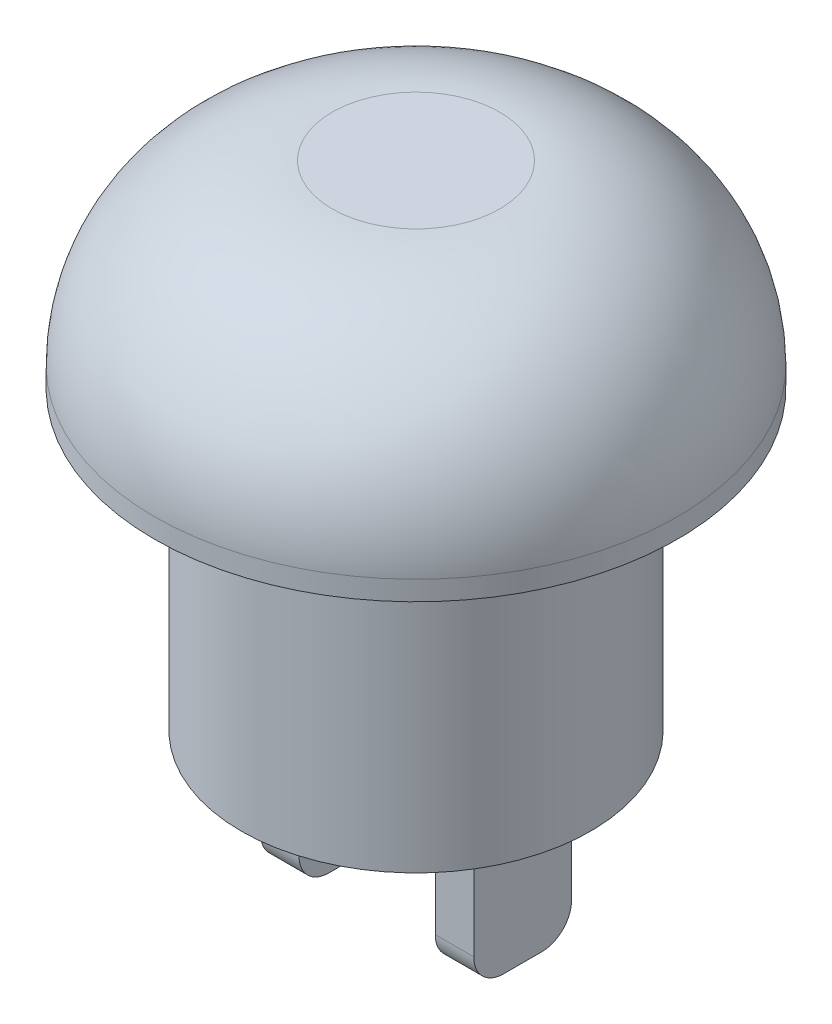
ISO-10303-21;
HEADER;
FILE_DESCRIPTION(('STEP AP214'),'2;1');
FILE_NAME('part.step','',(''),(''),'','','');
FILE_SCHEMA(('AUTOMOTIVE_DESIGN { 1 0 10303 214 1 1 1 1 }'));
ENDSEC;
DATA;
#1=APPLICATION_CONTEXT('core data for automotive mechanical design processes');
#2=APPLICATION_PROTOCOL_DEFINITION('international standard','automotive_design',2000,#1);
#3=PRODUCT_CONTEXT('',#1,'mechanical');
#4=PRODUCT('Part','Part','',(#3));
#5=PRODUCT_RELATED_PRODUCT_CATEGORY('part','',(#4));
#6=PRODUCT_DEFINITION_FORMATION('','',#4);
#7=PRODUCT_DEFINITION_CONTEXT('part definition',#1,'design');
#8=PRODUCT_DEFINITION('design','',#6,#7);
#9=PRODUCT_DEFINITION_SHAPE('','',#8);
#10=(LENGTH_UNIT() NAMED_UNIT(*) SI_UNIT(.MILLI.,.METRE.));
#11=(NAMED_UNIT(*) PLANE_ANGLE_UNIT() SI_UNIT($,.RADIAN.));
#12=(NAMED_UNIT(*) SI_UNIT($,.STERADIAN.) SOLID_ANGLE_UNIT());
#13=UNCERTAINTY_MEASURE_WITH_UNIT(LENGTH_MEASURE(1.E-05),#10,'distance_accuracy_value','');
#14=(GEOMETRIC_REPRESENTATION_CONTEXT(3) GLOBAL_UNCERTAINTY_ASSIGNED_CONTEXT((#13)) GLOBAL_UNIT_ASSIGNED_CONTEXT((#10,
#11,#12)) REPRESENTATION_CONTEXT('',''));
#15=CARTESIAN_POINT('',(0.,0.,0.));
#16=DIRECTION('',(0.,0.,1.));
#17=DIRECTION('',(1.,0.,0.));
#18=AXIS2_PLACEMENT_3D('',#15,#16,#17);
#19=CARTESIAN_POINT('',(0.,10.,0.));
#20=DIRECTION('',(0.,-1.,0.));
#21=DIRECTION('',(0.,0.,-1.));
#22=AXIS2_PLACEMENT_3D('',#19,#20,#21);
#23=CYLINDRICAL_SURFACE('',#22,5.9);
#24=CARTESIAN_POINT('',(0.,10.,0.));
#25=DIRECTION('',(0.,1.,0.));
#26=DIRECTION('',(0.,0.,1.));
#27=AXIS2_PLACEMENT_3D('',#24,#25,#26);
#28=CIRCLE('',#27,5.9);
#29=CARTESIAN_POINT('',(0.,10.,5.9));
#30=VERTEX_POINT('',#29);
#31=EDGE_CURVE('E196',#30,#30,#28,.T.);
#32=ORIENTED_EDGE('',*,*,#31,.F.);
#33=EDGE_LOOP('',(#32));
#34=FACE_BOUND('',#33,.T.);
#35=CARTESIAN_POINT('',(0.,0.,0.));
#36=DIRECTION('',(0.,1.,0.));
#37=DIRECTION('',(0.,0.,1.));
#38=AXIS2_PLACEMENT_3D('',#35,#36,#37);
#39=CIRCLE('',#38,5.9);
#40=CARTESIAN_POINT('',(0.,0.,5.9));
#41=VERTEX_POINT('',#40);
#42=EDGE_CURVE('E195',#41,#41,#39,.T.);
#43=ORIENTED_EDGE('',*,*,#42,.T.);
#44=EDGE_LOOP('',(#43));
#45=FACE_BOUND('',#44,.T.);
#46=ADVANCED_FACE('F43',(#34,#45),#23,.T.);
#47=CARTESIAN_POINT('',(0.,0.,0.));
#48=DIRECTION('',(0.,1.,0.));
#49=DIRECTION('',(0.,0.,1.));
#50=AXIS2_PLACEMENT_3D('',#47,#48,#49);
#51=PLANE('',#50);
#52=DIRECTION('',(1.,0.,0.));
#53=VECTOR('',#52,1.);
#54=CARTESIAN_POINT('',(0.,0.,-1.65));
#55=LINE('',#54,#53);
#56=CARTESIAN_POINT('',(-3.6,0.,-1.65));
#57=VERTEX_POINT('',#56);
#58=CARTESIAN_POINT('',(-2.3,0.,-1.65));
#59=VERTEX_POINT('',#58);
#60=EDGE_CURVE('E135',#57,#59,#55,.T.);
#61=ORIENTED_EDGE('',*,*,#60,.F.);
#62=DIRECTION('',(0.,0.,1.));
#63=VECTOR('',#62,1.);
#64=CARTESIAN_POINT('',(-3.6,0.,0.));
#65=LINE('',#64,#63);
#66=CARTESIAN_POINT('',(-3.6,0.,1.65));
#67=VERTEX_POINT('',#66);
#68=EDGE_CURVE('E143',#57,#67,#65,.T.);
#69=ORIENTED_EDGE('',*,*,#68,.T.);
#70=DIRECTION('',(1.,0.,0.));
#71=VECTOR('',#70,1.);
#72=CARTESIAN_POINT('',(0.,0.,1.65));
#73=LINE('',#72,#71);
#74=CARTESIAN_POINT('',(-2.3,0.,1.65));
#75=VERTEX_POINT('',#74);
#76=EDGE_CURVE('E156',#67,#75,#73,.T.);
#77=ORIENTED_EDGE('',*,*,#76,.T.);
#78=DIRECTION('',(0.,0.,1.));
#79=VECTOR('',#78,1.);
#80=CARTESIAN_POINT('',(-2.3,0.,0.));
#81=LINE('',#80,#79);
#82=EDGE_CURVE('E154',#59,#75,#81,.T.);
#83=ORIENTED_EDGE('',*,*,#82,.F.);
#84=EDGE_LOOP('',(#61,#69,#77,#83));
#85=FACE_BOUND('',#84,.T.);
#86=DIRECTION('',(0.,0.,1.));
#87=VECTOR('',#86,1.);
#88=CARTESIAN_POINT('',(3.6,0.,0.));
#89=LINE('',#88,#87);
#90=CARTESIAN_POINT('',(3.6,0.,-1.65));
#91=VERTEX_POINT('',#90);
#92=CARTESIAN_POINT('',(3.6,0.,1.65));
#93=VERTEX_POINT('',#92);
#94=EDGE_CURVE('E177',#91,#93,#89,.T.);
#95=ORIENTED_EDGE('',*,*,#94,.F.);
#96=DIRECTION('',(-1.,0.,0.));
#97=VECTOR('',#96,1.);
#98=CARTESIAN_POINT('',(0.,0.,-1.65));
#99=LINE('',#98,#97);
#100=CARTESIAN_POINT('',(2.3,0.,-1.65));
#101=VERTEX_POINT('',#100);
#102=EDGE_CURVE('E139',#91,#101,#99,.T.);
#103=ORIENTED_EDGE('',*,*,#102,.T.);
#104=DIRECTION('',(0.,0.,1.));
#105=VECTOR('',#104,1.);
#106=CARTESIAN_POINT('',(2.3,0.,0.));
#107=LINE('',#106,#105);
#108=CARTESIAN_POINT('',(2.3,0.,1.65));
#109=VERTEX_POINT('',#108);
#110=EDGE_CURVE('E171',#101,#109,#107,.T.);
#111=ORIENTED_EDGE('',*,*,#110,.T.);
#112=DIRECTION('',(-1.,0.,0.));
#113=VECTOR('',#112,1.);
#114=CARTESIAN_POINT('',(0.,0.,1.65));
#115=LINE('',#114,#113);
#116=EDGE_CURVE('E180',#93,#109,#115,.T.);
#117=ORIENTED_EDGE('',*,*,#116,.F.);
#118=EDGE_LOOP('',(#95,#103,#111,#117));
#119=FACE_BOUND('',#118,.T.);
#120=ORIENTED_EDGE('',*,*,#42,.F.);
#121=EDGE_LOOP('',(#120));
#122=FACE_BOUND('',#121,.T.);
#123=ADVANCED_FACE('F151',(#85,#119,#122),#51,.F.);
#124=CARTESIAN_POINT('',(0.,16.66,0.));
#125=DIRECTION('',(0.,-1.,0.));
#126=DIRECTION('',(0.,0.,-1.));
#127=AXIS2_PLACEMENT_3D('',#124,#125,#126);
#128=CYLINDRICAL_SURFACE('',#127,8.83);
#129=CARTESIAN_POINT('',(0.,10.66,0.));
#130=DIRECTION('',(0.,1.,0.));
#131=DIRECTION('',(0.,0.,1.));
#132=AXIS2_PLACEMENT_3D('',#129,#130,#131);
#133=CIRCLE('',#132,8.83);
#134=CARTESIAN_POINT('',(0.,10.66,8.83));
#135=VERTEX_POINT('',#134);
#136=EDGE_CURVE('E204',#135,#135,#133,.F.);
#137=ORIENTED_EDGE('',*,*,#136,.T.);
#138=EDGE_LOOP('',(#137));
#139=FACE_BOUND('',#138,.T.);
#140=CARTESIAN_POINT('',(0.,10.,0.));
#141=DIRECTION('',(0.,1.,0.));
#142=DIRECTION('',(0.,0.,1.));
#143=AXIS2_PLACEMENT_3D('',#140,#141,#142);
#144=CIRCLE('',#143,8.83);
#145=CARTESIAN_POINT('',(0.,10.,8.83));
#146=VERTEX_POINT('',#145);
#147=EDGE_CURVE('E192',#146,#146,#144,.T.);
#148=ORIENTED_EDGE('',*,*,#147,.T.);
#149=EDGE_LOOP('',(#148));
#150=FACE_BOUND('',#149,.T.);
#151=ADVANCED_FACE('F262',(#139,#150),#128,.T.);
#152=CARTESIAN_POINT('',(0.,16.66,0.));
#153=DIRECTION('',(0.,1.,0.));
#154=DIRECTION('',(0.,0.,1.));
#155=AXIS2_PLACEMENT_3D('',#152,#153,#154);
#156=PLANE('',#155);
#157=CARTESIAN_POINT('',(0.,16.66,0.));
#158=DIRECTION('',(0.,1.,0.));
#159=DIRECTION('',(0.,0.,1.));
#160=AXIS2_PLACEMENT_3D('',#157,#158,#159);
#161=CIRCLE('',#160,2.83);
#162=CARTESIAN_POINT('',(0.,16.66,2.83));
#163=VERTEX_POINT('',#162);
#164=EDGE_CURVE('E199',#163,#163,#161,.T.);
#165=ORIENTED_EDGE('',*,*,#164,.T.);
#166=EDGE_LOOP('',(#165));
#167=FACE_BOUND('',#166,.T.);
#168=ADVANCED_FACE('F320',(#167),#156,.T.);
#169=CARTESIAN_POINT('',(0.,10.,0.));
#170=DIRECTION('',(0.,1.,0.));
#171=DIRECTION('',(0.,0.,1.));
#172=AXIS2_PLACEMENT_3D('',#169,#170,#171);
#173=PLANE('',#172);
#174=ORIENTED_EDGE('',*,*,#31,.T.);
#175=EDGE_LOOP('',(#174));
#176=FACE_BOUND('',#175,.T.);
#177=ORIENTED_EDGE('',*,*,#147,.F.);
#178=EDGE_LOOP('',(#177));
#179=FACE_BOUND('',#178,.T.);
#180=ADVANCED_FACE('F272',(#176,#179),#173,.F.);
#181=CARTESIAN_POINT('',(0.,10.66,0.));
#182=DIRECTION('',(0.,1.,0.));
#183=DIRECTION('',(0.,0.,1.));
#184=AXIS2_PLACEMENT_3D('',#181,#182,#183);
#185=DEGENERATE_TOROIDAL_SURFACE('',#184,2.83,6.,.T.);
#186=ORIENTED_EDGE('',*,*,#136,.F.);
#187=EDGE_LOOP('',(#186));
#188=FACE_BOUND('',#187,.T.);
#189=ORIENTED_EDGE('',*,*,#164,.F.);
#190=EDGE_LOOP('',(#189));
#191=FACE_BOUND('',#190,.T.);
#192=ADVANCED_FACE('F268',(#188,#191),#185,.T.);
#193=CARTESIAN_POINT('',(0.,-5.,-1.65));
#194=DIRECTION('',(0.,0.,-1.));
#195=DIRECTION('',(-1.,0.,0.));
#196=AXIS2_PLACEMENT_3D('',#193,#194,#195);
#197=PLANE('',#196);
#198=DIRECTION('',(0.,1.,0.));
#199=VECTOR('',#198,1.);
#200=CARTESIAN_POINT('',(3.6,-5.,-1.65));
#201=LINE('',#200,#199);
#202=CARTESIAN_POINT('',(3.6,-4.,-1.65));
#203=VERTEX_POINT('',#202);
#204=EDGE_CURVE('E190',#203,#91,#201,.T.);
#205=ORIENTED_EDGE('',*,*,#204,.F.);
#206=DIRECTION('',(-1.,0.,0.));
#207=VECTOR('',#206,1.);
#208=CARTESIAN_POINT('',(0.,-4.,-1.65));
#209=LINE('',#208,#207);
#210=CARTESIAN_POINT('',(2.3,-4.,-1.65));
#211=VERTEX_POINT('',#210);
#212=EDGE_CURVE('E222',#203,#211,#209,.T.);
#213=ORIENTED_EDGE('',*,*,#212,.T.);
#214=DIRECTION('',(0.,1.,0.));
#215=VECTOR('',#214,1.);
#216=CARTESIAN_POINT('',(2.3,-5.,-1.65));
#217=LINE('',#216,#215);
#218=EDGE_CURVE('E174',#211,#101,#217,.T.);
#219=ORIENTED_EDGE('',*,*,#218,.T.);
#220=ORIENTED_EDGE('',*,*,#102,.F.);
#221=EDGE_LOOP('',(#205,#213,#219,#220));
#222=FACE_BOUND('',#221,.T.);
#223=ADVANCED_FACE('F271',(#222),#197,.T.);
#224=CARTESIAN_POINT('',(3.6,-5.,0.));
#225=DIRECTION('',(-1.,0.,0.));
#226=DIRECTION('',(0.,0.,1.));
#227=AXIS2_PLACEMENT_3D('',#224,#225,#226);
#228=PLANE('',#227);
#229=DIRECTION('',(0.,1.,0.));
#230=VECTOR('',#229,1.);
#231=CARTESIAN_POINT('',(3.6,-5.,1.65));
#232=LINE('',#231,#230);
#233=CARTESIAN_POINT('',(3.6,-4.,1.65));
#234=VERTEX_POINT('',#233);
#235=EDGE_CURVE('E188',#234,#93,#232,.T.);
#236=ORIENTED_EDGE('',*,*,#235,.F.);
#237=CARTESIAN_POINT('',(3.6,-4.,0.649999999999996));
#238=DIRECTION('',(-1.,0.,0.));
#239=DIRECTION('',(0.,0.,1.));
#240=AXIS2_PLACEMENT_3D('',#237,#238,#239);
#241=CIRCLE('',#240,1.);
#242=CARTESIAN_POINT('',(3.6,-5.,0.649999999999996));
#243=VERTEX_POINT('',#242);
#244=EDGE_CURVE('E220',#234,#243,#241,.F.);
#245=ORIENTED_EDGE('',*,*,#244,.T.);
#246=DIRECTION('',(0.,0.,1.));
#247=VECTOR('',#246,1.);
#248=CARTESIAN_POINT('',(3.6,-5.,0.));
#249=LINE('',#248,#247);
#250=CARTESIAN_POINT('',(3.6,-5.,-0.650000000000002));
#251=VERTEX_POINT('',#250);
#252=EDGE_CURVE('E167',#251,#243,#249,.T.);
#253=ORIENTED_EDGE('',*,*,#252,.F.);
#254=CARTESIAN_POINT('',(3.6,-4.,-0.650000000000002));
#255=DIRECTION('',(-1.,0.,0.));
#256=DIRECTION('',(0.,0.,1.));
#257=AXIS2_PLACEMENT_3D('',#254,#255,#256);
#258=CIRCLE('',#257,1.);
#259=EDGE_CURVE('E218',#251,#203,#258,.F.);
#260=ORIENTED_EDGE('',*,*,#259,.T.);
#261=ORIENTED_EDGE('',*,*,#204,.T.);
#262=ORIENTED_EDGE('',*,*,#94,.T.);
#263=EDGE_LOOP('',(#236,#245,#253,#260,#261,#262));
#264=FACE_BOUND('',#263,.T.);
#265=ADVANCED_FACE('F289',(#264),#228,.F.);
#266=CARTESIAN_POINT('',(0.,-5.,1.65));
#267=DIRECTION('',(0.,0.,-1.));
#268=DIRECTION('',(-1.,0.,0.));
#269=AXIS2_PLACEMENT_3D('',#266,#267,#268);
#270=PLANE('',#269);
#271=DIRECTION('',(0.,1.,0.));
#272=VECTOR('',#271,1.);
#273=CARTESIAN_POINT('',(2.3,-5.,1.65));
#274=LINE('',#273,#272);
#275=CARTESIAN_POINT('',(2.3,-4.,1.65));
#276=VERTEX_POINT('',#275);
#277=EDGE_CURVE('E186',#276,#109,#274,.T.);
#278=ORIENTED_EDGE('',*,*,#277,.F.);
#279=DIRECTION('',(-1.,0.,0.));
#280=VECTOR('',#279,1.);
#281=CARTESIAN_POINT('',(3.6,-4.,1.65));
#282=LINE('',#281,#280);
#283=EDGE_CURVE('E216',#276,#234,#282,.F.);
#284=ORIENTED_EDGE('',*,*,#283,.T.);
#285=ORIENTED_EDGE('',*,*,#235,.T.);
#286=ORIENTED_EDGE('',*,*,#116,.T.);
#287=EDGE_LOOP('',(#278,#284,#285,#286));
#288=FACE_BOUND('',#287,.T.);
#289=ADVANCED_FACE('F307',(#288),#270,.F.);
#290=CARTESIAN_POINT('',(2.3,-5.,0.));
#291=DIRECTION('',(-1.,0.,0.));
#292=DIRECTION('',(0.,0.,1.));
#293=AXIS2_PLACEMENT_3D('',#290,#291,#292);
#294=PLANE('',#293);
#295=DIRECTION('',(0.,0.,1.));
#296=VECTOR('',#295,1.);
#297=CARTESIAN_POINT('',(2.3,-5.,0.));
#298=LINE('',#297,#296);
#299=CARTESIAN_POINT('',(2.3,-5.,-0.650000000000002));
#300=VERTEX_POINT('',#299);
#301=CARTESIAN_POINT('',(2.3,-5.,0.649999999999996));
#302=VERTEX_POINT('',#301);
#303=EDGE_CURVE('E170',#300,#302,#298,.T.);
#304=ORIENTED_EDGE('',*,*,#303,.T.);
#305=CARTESIAN_POINT('',(2.3,-4.,0.649999999999996));
#306=DIRECTION('',(-1.,0.,0.));
#307=DIRECTION('',(0.,0.,1.));
#308=AXIS2_PLACEMENT_3D('',#305,#306,#307);
#309=CIRCLE('',#308,1.);
#310=EDGE_CURVE('E214',#302,#276,#309,.T.);
#311=ORIENTED_EDGE('',*,*,#310,.T.);
#312=ORIENTED_EDGE('',*,*,#277,.T.);
#313=ORIENTED_EDGE('',*,*,#110,.F.);
#314=ORIENTED_EDGE('',*,*,#218,.F.);
#315=CARTESIAN_POINT('',(2.3,-4.,-0.650000000000002));
#316=DIRECTION('',(-1.,0.,0.));
#317=DIRECTION('',(0.,0.,1.));
#318=AXIS2_PLACEMENT_3D('',#315,#316,#317);
#319=CIRCLE('',#318,1.);
#320=EDGE_CURVE('E212',#211,#300,#319,.T.);
#321=ORIENTED_EDGE('',*,*,#320,.T.);
#322=EDGE_LOOP('',(#304,#311,#312,#313,#314,#321));
#323=FACE_BOUND('',#322,.T.);
#324=ADVANCED_FACE('F305',(#323),#294,.T.);
#325=CARTESIAN_POINT('',(0.,-5.,0.));
#326=DIRECTION('',(0.,-1.,0.));
#327=DIRECTION('',(0.,0.,-1.));
#328=AXIS2_PLACEMENT_3D('',#325,#326,#327);
#329=PLANE('',#328);
#330=ORIENTED_EDGE('',*,*,#252,.T.);
#331=DIRECTION('',(-1.,0.,0.));
#332=VECTOR('',#331,1.);
#333=CARTESIAN_POINT('',(2.3,-5.,0.649999999999996));
#334=LINE('',#333,#332);
#335=EDGE_CURVE('E209',#243,#302,#334,.T.);
#336=ORIENTED_EDGE('',*,*,#335,.T.);
#337=ORIENTED_EDGE('',*,*,#303,.F.);
#338=DIRECTION('',(-1.,0.,0.));
#339=VECTOR('',#338,1.);
#340=CARTESIAN_POINT('',(0.,-5.,-0.650000000000002));
#341=LINE('',#340,#339);
#342=EDGE_CURVE('E207',#300,#251,#341,.F.);
#343=ORIENTED_EDGE('',*,*,#342,.T.);
#344=EDGE_LOOP('',(#330,#336,#337,#343));
#345=FACE_BOUND('',#344,.T.);
#346=ADVANCED_FACE('F303',(#345),#329,.T.);
#347=CARTESIAN_POINT('',(-3.6,-5.,0.));
#348=DIRECTION('',(-1.,0.,0.));
#349=DIRECTION('',(0.,0.,1.));
#350=AXIS2_PLACEMENT_3D('',#347,#348,#349);
#351=PLANE('',#350);
#352=DIRECTION('',(0.,0.,1.));
#353=VECTOR('',#352,1.);
#354=CARTESIAN_POINT('',(-3.6,-5.,0.));
#355=LINE('',#354,#353);
#356=CARTESIAN_POINT('',(-3.6,-5.,-0.65));
#357=VERTEX_POINT('',#356);
#358=CARTESIAN_POINT('',(-3.6,-5.,0.65));
#359=VERTEX_POINT('',#358);
#360=EDGE_CURVE('E161',#357,#359,#355,.T.);
#361=ORIENTED_EDGE('',*,*,#360,.T.);
#362=CARTESIAN_POINT('',(-3.6,-4.,0.65));
#363=DIRECTION('',(-1.,0.,0.));
#364=DIRECTION('',(0.,0.,1.));
#365=AXIS2_PLACEMENT_3D('',#362,#363,#364);
#366=CIRCLE('',#365,1.);
#367=CARTESIAN_POINT('',(-3.6,-4.,1.65));
#368=VERTEX_POINT('',#367);
#369=EDGE_CURVE('E51',#359,#368,#366,.T.);
#370=ORIENTED_EDGE('',*,*,#369,.T.);
#371=DIRECTION('',(0.,1.,0.));
#372=VECTOR('',#371,1.);
#373=CARTESIAN_POINT('',(-3.6,-5.,1.65));
#374=LINE('',#373,#372);
#375=EDGE_CURVE('E146',#368,#67,#374,.T.);
#376=ORIENTED_EDGE('',*,*,#375,.T.);
#377=ORIENTED_EDGE('',*,*,#68,.F.);
#378=DIRECTION('',(0.,1.,0.));
#379=VECTOR('',#378,1.);
#380=CARTESIAN_POINT('',(-3.6,-5.,-1.65));
#381=LINE('',#380,#379);
#382=CARTESIAN_POINT('',(-3.6,-4.,-1.65));
#383=VERTEX_POINT('',#382);
#384=EDGE_CURVE('E131',#383,#57,#381,.T.);
#385=ORIENTED_EDGE('',*,*,#384,.F.);
#386=CARTESIAN_POINT('',(-3.6,-4.,-0.65));
#387=DIRECTION('',(-1.,0.,0.));
#388=DIRECTION('',(0.,0.,1.));
#389=AXIS2_PLACEMENT_3D('',#386,#387,#388);
#390=CIRCLE('',#389,1.);
#391=EDGE_CURVE('E236',#383,#357,#390,.T.);
#392=ORIENTED_EDGE('',*,*,#391,.T.);
#393=EDGE_LOOP('',(#361,#370,#376,#377,#385,#392));
#394=FACE_BOUND('',#393,.T.);
#395=ADVANCED_FACE('F144',(#394),#351,.T.);
#396=CARTESIAN_POINT('',(0.,-5.,-1.65));
#397=DIRECTION('',(0.,0.,1.));
#398=DIRECTION('',(1.,0.,0.));
#399=AXIS2_PLACEMENT_3D('',#396,#397,#398);
#400=PLANE('',#399);
#401=DIRECTION('',(0.,1.,0.));
#402=VECTOR('',#401,1.);
#403=CARTESIAN_POINT('',(-2.3,-5.,-1.65));
#404=LINE('',#403,#402);
#405=CARTESIAN_POINT('',(-2.3,-4.,-1.65));
#406=VERTEX_POINT('',#405);
#407=EDGE_CURVE('E140',#406,#59,#404,.T.);
#408=ORIENTED_EDGE('',*,*,#407,.F.);
#409=DIRECTION('',(1.,0.,0.));
#410=VECTOR('',#409,1.);
#411=CARTESIAN_POINT('',(-3.6,-4.,-1.65));
#412=LINE('',#411,#410);
#413=EDGE_CURVE('E11',#406,#383,#412,.F.);
#414=ORIENTED_EDGE('',*,*,#413,.T.);
#415=ORIENTED_EDGE('',*,*,#384,.T.);
#416=ORIENTED_EDGE('',*,*,#60,.T.);
#417=EDGE_LOOP('',(#408,#414,#415,#416));
#418=FACE_BOUND('',#417,.T.);
#419=ADVANCED_FACE('F133',(#418),#400,.F.);
#420=CARTESIAN_POINT('',(-2.3,-5.,0.));
#421=DIRECTION('',(-1.,0.,0.));
#422=DIRECTION('',(0.,0.,1.));
#423=AXIS2_PLACEMENT_3D('',#420,#421,#422);
#424=PLANE('',#423);
#425=DIRECTION('',(0.,1.,0.));
#426=VECTOR('',#425,1.);
#427=CARTESIAN_POINT('',(-2.3,-5.,1.65));
#428=LINE('',#427,#426);
#429=CARTESIAN_POINT('',(-2.3,-4.,1.65));
#430=VERTEX_POINT('',#429);
#431=EDGE_CURVE('E163',#430,#75,#428,.T.);
#432=ORIENTED_EDGE('',*,*,#431,.F.);
#433=CARTESIAN_POINT('',(-2.3,-4.,0.65));
#434=DIRECTION('',(-1.,0.,0.));
#435=DIRECTION('',(0.,0.,1.));
#436=AXIS2_PLACEMENT_3D('',#433,#434,#435);
#437=CIRCLE('',#436,1.);
#438=CARTESIAN_POINT('',(-2.3,-5.,0.65));
#439=VERTEX_POINT('',#438);
#440=EDGE_CURVE('E230',#430,#439,#437,.F.);
#441=ORIENTED_EDGE('',*,*,#440,.T.);
#442=DIRECTION('',(0.,0.,1.));
#443=VECTOR('',#442,1.);
#444=CARTESIAN_POINT('',(-2.3,-5.,0.));
#445=LINE('',#444,#443);
#446=CARTESIAN_POINT('',(-2.3,-5.,-0.65));
#447=VERTEX_POINT('',#446);
#448=EDGE_CURVE('E164',#447,#439,#445,.T.);
#449=ORIENTED_EDGE('',*,*,#448,.F.);
#450=CARTESIAN_POINT('',(-2.3,-4.,-0.65));
#451=DIRECTION('',(-1.,0.,0.));
#452=DIRECTION('',(0.,0.,1.));
#453=AXIS2_PLACEMENT_3D('',#450,#451,#452);
#454=CIRCLE('',#453,1.);
#455=EDGE_CURVE('E228',#447,#406,#454,.F.);
#456=ORIENTED_EDGE('',*,*,#455,.T.);
#457=ORIENTED_EDGE('',*,*,#407,.T.);
#458=ORIENTED_EDGE('',*,*,#82,.T.);
#459=EDGE_LOOP('',(#432,#441,#449,#456,#457,#458));
#460=FACE_BOUND('',#459,.T.);
#461=ADVANCED_FACE('F246',(#460),#424,.F.);
#462=CARTESIAN_POINT('',(0.,-5.,1.65));
#463=DIRECTION('',(0.,0.,1.));
#464=DIRECTION('',(1.,0.,0.));
#465=AXIS2_PLACEMENT_3D('',#462,#463,#464);
#466=PLANE('',#465);
#467=ORIENTED_EDGE('',*,*,#375,.F.);
#468=DIRECTION('',(1.,0.,0.));
#469=VECTOR('',#468,1.);
#470=CARTESIAN_POINT('',(0.,-4.,1.65));
#471=LINE('',#470,#469);
#472=EDGE_CURVE('E225',#368,#430,#471,.T.);
#473=ORIENTED_EDGE('',*,*,#472,.T.);
#474=ORIENTED_EDGE('',*,*,#431,.T.);
#475=ORIENTED_EDGE('',*,*,#76,.F.);
#476=EDGE_LOOP('',(#467,#473,#474,#475));
#477=FACE_BOUND('',#476,.T.);
#478=ADVANCED_FACE('F241',(#477),#466,.T.);
#479=CARTESIAN_POINT('',(0.,-5.,0.));
#480=DIRECTION('',(0.,-1.,0.));
#481=DIRECTION('',(0.,0.,-1.));
#482=AXIS2_PLACEMENT_3D('',#479,#480,#481);
#483=PLANE('',#482);
#484=ORIENTED_EDGE('',*,*,#448,.T.);
#485=DIRECTION('',(1.,0.,0.));
#486=VECTOR('',#485,1.);
#487=CARTESIAN_POINT('',(0.,-5.,0.65));
#488=LINE('',#487,#486);
#489=EDGE_CURVE('E64',#439,#359,#488,.F.);
#490=ORIENTED_EDGE('',*,*,#489,.T.);
#491=ORIENTED_EDGE('',*,*,#360,.F.);
#492=DIRECTION('',(1.,0.,0.));
#493=VECTOR('',#492,1.);
#494=CARTESIAN_POINT('',(-2.3,-5.,-0.65));
#495=LINE('',#494,#493);
#496=EDGE_CURVE('E232',#357,#447,#495,.T.);
#497=ORIENTED_EDGE('',*,*,#496,.T.);
#498=EDGE_LOOP('',(#484,#490,#491,#497));
#499=FACE_BOUND('',#498,.T.);
#500=ADVANCED_FACE('F247',(#499),#483,.T.);
#501=CARTESIAN_POINT('',(0.,-4.,0.649999999999996));
#502=DIRECTION('',(1.,0.,0.));
#503=DIRECTION('',(0.,0.,-1.));
#504=AXIS2_PLACEMENT_3D('',#501,#502,#503);
#505=CYLINDRICAL_SURFACE('',#504,1.);
#506=ORIENTED_EDGE('',*,*,#244,.F.);
#507=ORIENTED_EDGE('',*,*,#283,.F.);
#508=ORIENTED_EDGE('',*,*,#310,.F.);
#509=ORIENTED_EDGE('',*,*,#335,.F.);
#510=EDGE_LOOP('',(#506,#507,#508,#509));
#511=FACE_BOUND('',#510,.T.);
#512=ADVANCED_FACE('F274',(#511),#505,.T.);
#513=CARTESIAN_POINT('',(0.,-4.,-0.650000000000002));
#514=DIRECTION('',(-1.,0.,0.));
#515=DIRECTION('',(0.,0.,1.));
#516=AXIS2_PLACEMENT_3D('',#513,#514,#515);
#517=CYLINDRICAL_SURFACE('',#516,1.);
#518=ORIENTED_EDGE('',*,*,#259,.F.);
#519=ORIENTED_EDGE('',*,*,#342,.F.);
#520=ORIENTED_EDGE('',*,*,#320,.F.);
#521=ORIENTED_EDGE('',*,*,#212,.F.);
#522=EDGE_LOOP('',(#518,#519,#520,#521));
#523=FACE_BOUND('',#522,.T.);
#524=ADVANCED_FACE('F255',(#523),#517,.T.);
#525=CARTESIAN_POINT('',(0.,-4.,0.65));
#526=DIRECTION('',(1.,0.,0.));
#527=DIRECTION('',(0.,0.,-1.));
#528=AXIS2_PLACEMENT_3D('',#525,#526,#527);
#529=CYLINDRICAL_SURFACE('',#528,1.);
#530=ORIENTED_EDGE('',*,*,#369,.F.);
#531=ORIENTED_EDGE('',*,*,#489,.F.);
#532=ORIENTED_EDGE('',*,*,#440,.F.);
#533=ORIENTED_EDGE('',*,*,#472,.F.);
#534=EDGE_LOOP('',(#530,#531,#532,#533));
#535=FACE_BOUND('',#534,.T.);
#536=ADVANCED_FACE('F243',(#535),#529,.T.);
#537=CARTESIAN_POINT('',(0.,-4.,-0.65));
#538=DIRECTION('',(-1.,0.,0.));
#539=DIRECTION('',(0.,0.,1.));
#540=AXIS2_PLACEMENT_3D('',#537,#538,#539);
#541=CYLINDRICAL_SURFACE('',#540,1.);
#542=ORIENTED_EDGE('',*,*,#391,.F.);
#543=ORIENTED_EDGE('',*,*,#413,.F.);
#544=ORIENTED_EDGE('',*,*,#455,.F.);
#545=ORIENTED_EDGE('',*,*,#496,.F.);
#546=EDGE_LOOP('',(#542,#543,#544,#545));
#547=FACE_BOUND('',#546,.T.);
#548=ADVANCED_FACE('F45',(#547),#541,.T.);
#549=CLOSED_SHELL('',(#46,#123,#151,#168,#180,#192,#223,#265,#289,#324,#346,#395,#419,#461,#478,
#500,#512,#524,#536,#548));
#550=MANIFOLD_SOLID_BREP('B2',#549);
#551=ADVANCED_BREP_SHAPE_REPRESENTATION('',(#18,#550),#14);
#552=SHAPE_DEFINITION_REPRESENTATION(#9,#551);
ENDSEC;
END-ISO-10303-21;
